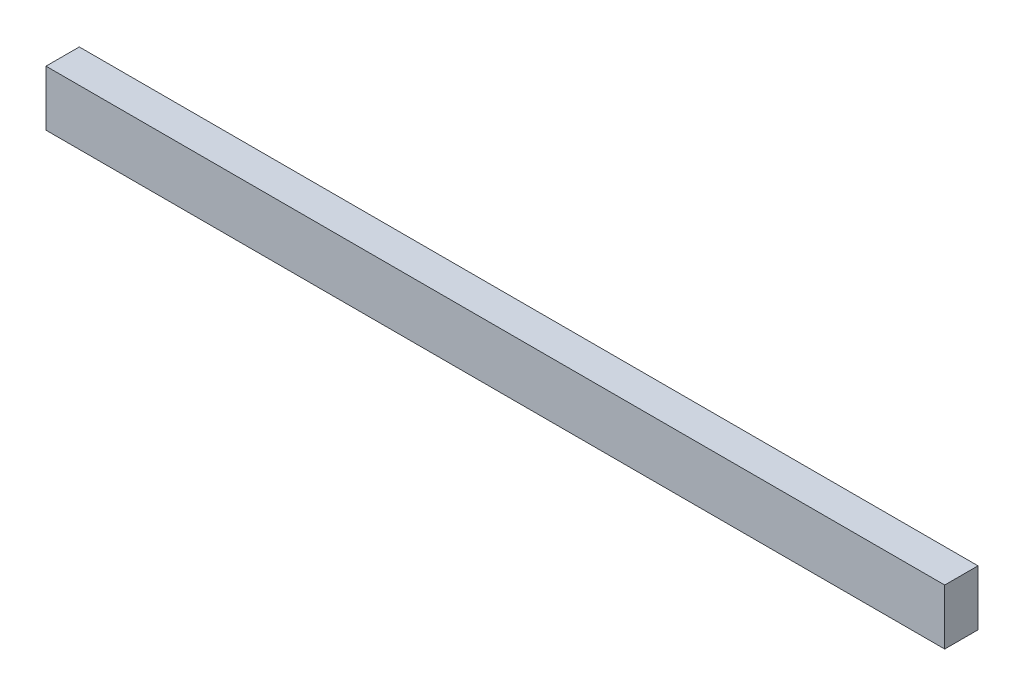
ISO-10303-21;
HEADER;
FILE_DESCRIPTION(('STEP AP214'),'2;1');
FILE_NAME('part.step','',(''),(''),'','','');
FILE_SCHEMA(('AUTOMOTIVE_DESIGN { 1 0 10303 214 1 1 1 1 }'));
ENDSEC;
DATA;
#1=APPLICATION_CONTEXT('core data for automotive mechanical design processes');
#2=APPLICATION_PROTOCOL_DEFINITION('international standard','automotive_design',2000,#1);
#3=PRODUCT_CONTEXT('',#1,'mechanical');
#4=PRODUCT('Part','Part','',(#3));
#5=PRODUCT_RELATED_PRODUCT_CATEGORY('part','',(#4));
#6=PRODUCT_DEFINITION_FORMATION('','',#4);
#7=PRODUCT_DEFINITION_CONTEXT('part definition',#1,'design');
#8=PRODUCT_DEFINITION('design','',#6,#7);
#9=PRODUCT_DEFINITION_SHAPE('','',#8);
#10=(LENGTH_UNIT() NAMED_UNIT(*) SI_UNIT(.MILLI.,.METRE.));
#11=(NAMED_UNIT(*) PLANE_ANGLE_UNIT() SI_UNIT($,.RADIAN.));
#12=(NAMED_UNIT(*) SI_UNIT($,.STERADIAN.) SOLID_ANGLE_UNIT());
#13=UNCERTAINTY_MEASURE_WITH_UNIT(LENGTH_MEASURE(1.E-05),#10,'distance_accuracy_value','');
#14=(GEOMETRIC_REPRESENTATION_CONTEXT(3) GLOBAL_UNCERTAINTY_ASSIGNED_CONTEXT((#13)) GLOBAL_UNIT_ASSIGNED_CONTEXT((#10,
#11,#12)) REPRESENTATION_CONTEXT('',''));
#15=CARTESIAN_POINT('',(0.,0.,0.));
#16=DIRECTION('',(0.,0.,1.));
#17=DIRECTION('',(1.,0.,0.));
#18=AXIS2_PLACEMENT_3D('',#15,#16,#17);
#19=CARTESIAN_POINT('',(257.175,31.75,9.525));
#20=DIRECTION('',(-1.,0.,0.));
#21=DIRECTION('',(0.,0.,1.));
#22=AXIS2_PLACEMENT_3D('',#19,#20,#21);
#23=PLANE('',#22);
#24=DIRECTION('',(0.,0.,-1.));
#25=VECTOR('',#24,1.);
#26=CARTESIAN_POINT('',(257.175,0.,9.525));
#27=LINE('',#26,#25);
#28=CARTESIAN_POINT('',(257.175,0.,9.525));
#29=VERTEX_POINT('',#28);
#30=CARTESIAN_POINT('',(257.175,0.,-9.525));
#31=VERTEX_POINT('',#30);
#32=EDGE_CURVE('E141',#29,#31,#27,.T.);
#33=ORIENTED_EDGE('',*,*,#32,.T.);
#34=DIRECTION('',(0.,-1.,0.));
#35=VECTOR('',#34,1.);
#36=CARTESIAN_POINT('',(257.175,31.75,-9.525));
#37=LINE('',#36,#35);
#38=CARTESIAN_POINT('',(257.175,31.75,-9.525));
#39=VERTEX_POINT('',#38);
#40=EDGE_CURVE('E11',#39,#31,#37,.T.);
#41=ORIENTED_EDGE('',*,*,#40,.F.);
#42=DIRECTION('',(0.,0.,-1.));
#43=VECTOR('',#42,1.);
#44=CARTESIAN_POINT('',(257.175,31.75,9.525));
#45=LINE('',#44,#43);
#46=CARTESIAN_POINT('',(257.175,31.75,9.525));
#47=VERTEX_POINT('',#46);
#48=EDGE_CURVE('E142',#47,#39,#45,.T.);
#49=ORIENTED_EDGE('',*,*,#48,.F.);
#50=DIRECTION('',(0.,-1.,0.));
#51=VECTOR('',#50,1.);
#52=CARTESIAN_POINT('',(257.175,31.75,9.525));
#53=LINE('',#52,#51);
#54=EDGE_CURVE('E148',#47,#29,#53,.T.);
#55=ORIENTED_EDGE('',*,*,#54,.T.);
#56=EDGE_LOOP('',(#33,#41,#49,#55));
#57=FACE_BOUND('',#56,.T.);
#58=ADVANCED_FACE('F39',(#57),#23,.F.);
#59=CARTESIAN_POINT('',(-257.175,31.75,-9.525));
#60=DIRECTION('',(0.,0.,1.));
#61=DIRECTION('',(1.,0.,0.));
#62=AXIS2_PLACEMENT_3D('',#59,#60,#61);
#63=PLANE('',#62);
#64=CARTESIAN_POINT('',(171.45,15.875,-9.525));
#65=DIRECTION('',(0.,0.,-1.));
#66=DIRECTION('',(-1.,0.,0.));
#67=AXIS2_PLACEMENT_3D('',#64,#65,#66);
#68=CIRCLE('',#67,1.58749999999999);
#69=CARTESIAN_POINT('',(169.8625,15.875,-9.525));
#70=VERTEX_POINT('',#69);
#71=EDGE_CURVE('E113',#70,#70,#68,.T.);
#72=ORIENTED_EDGE('',*,*,#71,.F.);
#73=EDGE_LOOP('',(#72));
#74=FACE_BOUND('',#73,.T.);
#75=CARTESIAN_POINT('',(85.7250000000001,15.875,-9.525));
#76=DIRECTION('',(0.,0.,-1.));
#77=DIRECTION('',(-1.,0.,0.));
#78=AXIS2_PLACEMENT_3D('',#75,#76,#77);
#79=CIRCLE('',#78,1.58749999999999);
#80=CARTESIAN_POINT('',(84.1375000000001,15.875,-9.525));
#81=VERTEX_POINT('',#80);
#82=EDGE_CURVE('E112',#81,#81,#79,.T.);
#83=ORIENTED_EDGE('',*,*,#82,.F.);
#84=EDGE_LOOP('',(#83));
#85=FACE_BOUND('',#84,.T.);
#86=CARTESIAN_POINT('',(0.,15.875,-9.525));
#87=DIRECTION('',(0.,0.,-1.));
#88=DIRECTION('',(-1.,0.,0.));
#89=AXIS2_PLACEMENT_3D('',#86,#87,#88);
#90=CIRCLE('',#89,1.58749999999999);
#91=CARTESIAN_POINT('',(-1.58749999999993,15.875,-9.525));
#92=VERTEX_POINT('',#91);
#93=EDGE_CURVE('E123',#92,#92,#90,.T.);
#94=ORIENTED_EDGE('',*,*,#93,.F.);
#95=EDGE_LOOP('',(#94));
#96=FACE_BOUND('',#95,.T.);
#97=CARTESIAN_POINT('',(-85.7249999999999,15.875,-9.525));
#98=DIRECTION('',(0.,0.,-1.));
#99=DIRECTION('',(-1.,0.,0.));
#100=AXIS2_PLACEMENT_3D('',#97,#98,#99);
#101=CIRCLE('',#100,1.58749999999999);
#102=CARTESIAN_POINT('',(-87.3124999999999,15.875,-9.525));
#103=VERTEX_POINT('',#102);
#104=EDGE_CURVE('E129',#103,#103,#101,.T.);
#105=ORIENTED_EDGE('',*,*,#104,.F.);
#106=EDGE_LOOP('',(#105));
#107=FACE_BOUND('',#106,.T.);
#108=CARTESIAN_POINT('',(-171.45,15.875,-9.525));
#109=DIRECTION('',(0.,0.,-1.));
#110=DIRECTION('',(-1.,0.,0.));
#111=AXIS2_PLACEMENT_3D('',#108,#109,#110);
#112=CIRCLE('',#111,1.58749999999999);
#113=CARTESIAN_POINT('',(-173.0375,15.875,-9.525));
#114=VERTEX_POINT('',#113);
#115=EDGE_CURVE('E135',#114,#114,#112,.T.);
#116=ORIENTED_EDGE('',*,*,#115,.F.);
#117=EDGE_LOOP('',(#116));
#118=FACE_BOUND('',#117,.T.);
#119=DIRECTION('',(-1.,0.,0.));
#120=VECTOR('',#119,1.);
#121=CARTESIAN_POINT('',(-257.175,0.,-9.525));
#122=LINE('',#121,#120);
#123=CARTESIAN_POINT('',(-257.175,0.,-9.525));
#124=VERTEX_POINT('',#123);
#125=EDGE_CURVE('E151',#31,#124,#122,.T.);
#126=ORIENTED_EDGE('',*,*,#125,.T.);
#127=DIRECTION('',(0.,-1.,0.));
#128=VECTOR('',#127,1.);
#129=CARTESIAN_POINT('',(-257.175,31.75,-9.525));
#130=LINE('',#129,#128);
#131=CARTESIAN_POINT('',(-257.175,31.75,-9.525));
#132=VERTEX_POINT('',#131);
#133=EDGE_CURVE('E47',#132,#124,#130,.T.);
#134=ORIENTED_EDGE('',*,*,#133,.F.);
#135=DIRECTION('',(-1.,0.,0.));
#136=VECTOR('',#135,1.);
#137=CARTESIAN_POINT('',(-257.175,31.75,-9.525));
#138=LINE('',#137,#136);
#139=EDGE_CURVE('E86',#39,#132,#138,.T.);
#140=ORIENTED_EDGE('',*,*,#139,.F.);
#141=ORIENTED_EDGE('',*,*,#40,.T.);
#142=EDGE_LOOP('',(#126,#134,#140,#141));
#143=FACE_BOUND('',#142,.T.);
#144=ADVANCED_FACE('F174',(#74,#85,#96,#107,#118,#143),#63,.F.);
#145=CARTESIAN_POINT('',(-257.175,31.75,9.525));
#146=DIRECTION('',(1.,0.,0.));
#147=DIRECTION('',(0.,0.,-1.));
#148=AXIS2_PLACEMENT_3D('',#145,#146,#147);
#149=PLANE('',#148);
#150=DIRECTION('',(0.,0.,1.));
#151=VECTOR('',#150,1.);
#152=CARTESIAN_POINT('',(-257.175,0.,9.525));
#153=LINE('',#152,#151);
#154=CARTESIAN_POINT('',(-257.175,0.,9.525));
#155=VERTEX_POINT('',#154);
#156=EDGE_CURVE('E73',#124,#155,#153,.T.);
#157=ORIENTED_EDGE('',*,*,#156,.T.);
#158=DIRECTION('',(0.,-1.,0.));
#159=VECTOR('',#158,1.);
#160=CARTESIAN_POINT('',(-257.175,31.75,9.525));
#161=LINE('',#160,#159);
#162=CARTESIAN_POINT('',(-257.175,31.75,9.525));
#163=VERTEX_POINT('',#162);
#164=EDGE_CURVE('E156',#163,#155,#161,.T.);
#165=ORIENTED_EDGE('',*,*,#164,.F.);
#166=DIRECTION('',(0.,0.,1.));
#167=VECTOR('',#166,1.);
#168=CARTESIAN_POINT('',(-257.175,31.75,9.525));
#169=LINE('',#168,#167);
#170=EDGE_CURVE('E145',#132,#163,#169,.T.);
#171=ORIENTED_EDGE('',*,*,#170,.F.);
#172=ORIENTED_EDGE('',*,*,#133,.T.);
#173=EDGE_LOOP('',(#157,#165,#171,#172));
#174=FACE_BOUND('',#173,.T.);
#175=ADVANCED_FACE('F158',(#174),#149,.F.);
#176=CARTESIAN_POINT('',(-257.175,31.75,9.525));
#177=DIRECTION('',(0.,0.,-1.));
#178=DIRECTION('',(-1.,0.,0.));
#179=AXIS2_PLACEMENT_3D('',#176,#177,#178);
#180=PLANE('',#179);
#181=DIRECTION('',(1.,0.,0.));
#182=VECTOR('',#181,1.);
#183=CARTESIAN_POINT('',(-257.175,0.,9.525));
#184=LINE('',#183,#182);
#185=EDGE_CURVE('E79',#155,#29,#184,.T.);
#186=ORIENTED_EDGE('',*,*,#185,.T.);
#187=ORIENTED_EDGE('',*,*,#54,.F.);
#188=DIRECTION('',(1.,0.,0.));
#189=VECTOR('',#188,1.);
#190=CARTESIAN_POINT('',(-257.175,31.75,9.525));
#191=LINE('',#190,#189);
#192=EDGE_CURVE('E55',#163,#47,#191,.T.);
#193=ORIENTED_EDGE('',*,*,#192,.F.);
#194=ORIENTED_EDGE('',*,*,#164,.T.);
#195=EDGE_LOOP('',(#186,#187,#193,#194));
#196=FACE_BOUND('',#195,.T.);
#197=ADVANCED_FACE('F165',(#196),#180,.F.);
#198=CARTESIAN_POINT('',(0.,31.75,0.));
#199=DIRECTION('',(0.,-1.,0.));
#200=DIRECTION('',(0.,0.,-1.));
#201=AXIS2_PLACEMENT_3D('',#198,#199,#200);
#202=PLANE('',#201);
#203=ORIENTED_EDGE('',*,*,#48,.T.);
#204=ORIENTED_EDGE('',*,*,#139,.T.);
#205=ORIENTED_EDGE('',*,*,#170,.T.);
#206=ORIENTED_EDGE('',*,*,#192,.T.);
#207=EDGE_LOOP('',(#203,#204,#205,#206));
#208=FACE_BOUND('',#207,.T.);
#209=ADVANCED_FACE('F167',(#208),#202,.F.);
#210=CARTESIAN_POINT('',(0.,0.,0.));
#211=DIRECTION('',(0.,-1.,0.));
#212=DIRECTION('',(0.,0.,-1.));
#213=AXIS2_PLACEMENT_3D('',#210,#211,#212);
#214=PLANE('',#213);
#215=ORIENTED_EDGE('',*,*,#32,.F.);
#216=ORIENTED_EDGE('',*,*,#185,.F.);
#217=ORIENTED_EDGE('',*,*,#156,.F.);
#218=ORIENTED_EDGE('',*,*,#125,.F.);
#219=EDGE_LOOP('',(#215,#216,#217,#218));
#220=FACE_BOUND('',#219,.T.);
#221=ADVANCED_FACE('F161',(#220),#214,.T.);
#222=CARTESIAN_POINT('',(-171.45,15.875,1.5875));
#223=DIRECTION('',(0.,0.,-1.));
#224=DIRECTION('',(-1.,0.,0.));
#225=AXIS2_PLACEMENT_3D('',#222,#223,#224);
#226=CONICAL_SURFACE('',#225,1.58749999999999,1.02974425867665);
#227=CARTESIAN_POINT('',(-171.45,15.875,2.54136623270625));
#228=VERTEX_POINT('',#227);
#229=VERTEX_LOOP('',#228);
#230=FACE_BOUND('',#229,.T.);
#231=CARTESIAN_POINT('',(-171.45,15.875,1.5875));
#232=DIRECTION('',(0.,0.,-1.));
#233=DIRECTION('',(-1.,0.,0.));
#234=AXIS2_PLACEMENT_3D('',#231,#232,#233);
#235=CIRCLE('',#234,1.58749999999999);
#236=CARTESIAN_POINT('',(-173.0375,15.875,1.5875));
#237=VERTEX_POINT('',#236);
#238=EDGE_CURVE('E138',#237,#237,#235,.T.);
#239=ORIENTED_EDGE('',*,*,#238,.T.);
#240=EDGE_LOOP('',(#239));
#241=FACE_BOUND('',#240,.T.);
#242=ADVANCED_FACE('F199',(#230,#241),#226,.F.);
#243=CARTESIAN_POINT('',(-171.45,15.875,-9.525));
#244=DIRECTION('',(0.,0.,-1.));
#245=DIRECTION('',(-1.,0.,0.));
#246=AXIS2_PLACEMENT_3D('',#243,#244,#245);
#247=CYLINDRICAL_SURFACE('',#246,1.58749999999999);
#248=ORIENTED_EDGE('',*,*,#238,.F.);
#249=EDGE_LOOP('',(#248));
#250=FACE_BOUND('',#249,.T.);
#251=ORIENTED_EDGE('',*,*,#115,.T.);
#252=EDGE_LOOP('',(#251));
#253=FACE_BOUND('',#252,.T.);
#254=ADVANCED_FACE('F196',(#250,#253),#247,.F.);
#255=CARTESIAN_POINT('',(-85.7249999999999,15.875,1.5875));
#256=DIRECTION('',(0.,0.,-1.));
#257=DIRECTION('',(-1.,0.,0.));
#258=AXIS2_PLACEMENT_3D('',#255,#256,#257);
#259=CONICAL_SURFACE('',#258,1.58749999999999,1.02974425867665);
#260=CARTESIAN_POINT('',(-85.7249999999999,15.875,2.54136623270625));
#261=VERTEX_POINT('',#260);
#262=VERTEX_LOOP('',#261);
#263=FACE_BOUND('',#262,.T.);
#264=CARTESIAN_POINT('',(-85.7249999999999,15.875,1.5875));
#265=DIRECTION('',(0.,0.,-1.));
#266=DIRECTION('',(-1.,0.,0.));
#267=AXIS2_PLACEMENT_3D('',#264,#265,#266);
#268=CIRCLE('',#267,1.58749999999999);
#269=CARTESIAN_POINT('',(-87.3124999999999,15.875,1.5875));
#270=VERTEX_POINT('',#269);
#271=EDGE_CURVE('E132',#270,#270,#268,.T.);
#272=ORIENTED_EDGE('',*,*,#271,.T.);
#273=EDGE_LOOP('',(#272));
#274=FACE_BOUND('',#273,.T.);
#275=ADVANCED_FACE('F198',(#263,#274),#259,.F.);
#276=CARTESIAN_POINT('',(-85.7249999999999,15.875,-9.525));
#277=DIRECTION('',(0.,0.,-1.));
#278=DIRECTION('',(-1.,0.,0.));
#279=AXIS2_PLACEMENT_3D('',#276,#277,#278);
#280=CYLINDRICAL_SURFACE('',#279,1.58749999999999);
#281=ORIENTED_EDGE('',*,*,#271,.F.);
#282=EDGE_LOOP('',(#281));
#283=FACE_BOUND('',#282,.T.);
#284=ORIENTED_EDGE('',*,*,#104,.T.);
#285=EDGE_LOOP('',(#284));
#286=FACE_BOUND('',#285,.T.);
#287=ADVANCED_FACE('F206',(#283,#286),#280,.F.);
#288=CARTESIAN_POINT('',(0.,15.875,1.5875));
#289=DIRECTION('',(0.,0.,-1.));
#290=DIRECTION('',(-1.,0.,0.));
#291=AXIS2_PLACEMENT_3D('',#288,#289,#290);
#292=CONICAL_SURFACE('',#291,1.5875,1.02974425867665);
#293=CARTESIAN_POINT('',(0.,15.875,2.54136623270625));
#294=VERTEX_POINT('',#293);
#295=VERTEX_LOOP('',#294);
#296=FACE_BOUND('',#295,.T.);
#297=CARTESIAN_POINT('',(0.,15.875,1.5875));
#298=DIRECTION('',(0.,0.,-1.));
#299=DIRECTION('',(-1.,0.,0.));
#300=AXIS2_PLACEMENT_3D('',#297,#298,#299);
#301=CIRCLE('',#300,1.5875);
#302=CARTESIAN_POINT('',(-1.58749999999994,15.875,1.5875));
#303=VERTEX_POINT('',#302);
#304=EDGE_CURVE('E126',#303,#303,#301,.T.);
#305=ORIENTED_EDGE('',*,*,#304,.T.);
#306=EDGE_LOOP('',(#305));
#307=FACE_BOUND('',#306,.T.);
#308=ADVANCED_FACE('F239',(#296,#307),#292,.F.);
#309=CARTESIAN_POINT('',(0.,15.875,-9.525));
#310=DIRECTION('',(0.,0.,-1.));
#311=DIRECTION('',(-1.,0.,0.));
#312=AXIS2_PLACEMENT_3D('',#309,#310,#311);
#313=CYLINDRICAL_SURFACE('',#312,1.58749999999999);
#314=ORIENTED_EDGE('',*,*,#304,.F.);
#315=EDGE_LOOP('',(#314));
#316=FACE_BOUND('',#315,.T.);
#317=ORIENTED_EDGE('',*,*,#93,.T.);
#318=EDGE_LOOP('',(#317));
#319=FACE_BOUND('',#318,.T.);
#320=ADVANCED_FACE('F248',(#316,#319),#313,.F.);
#321=CARTESIAN_POINT('',(85.7250000000001,15.875,1.5875));
#322=DIRECTION('',(0.,0.,-1.));
#323=DIRECTION('',(-1.,0.,0.));
#324=AXIS2_PLACEMENT_3D('',#321,#322,#323);
#325=CONICAL_SURFACE('',#324,1.58749999999999,1.02974425867665);
#326=CARTESIAN_POINT('',(85.7250000000001,15.875,2.54136623270625));
#327=VERTEX_POINT('',#326);
#328=VERTEX_LOOP('',#327);
#329=FACE_BOUND('',#328,.T.);
#330=CARTESIAN_POINT('',(85.7250000000001,15.875,1.5875));
#331=DIRECTION('',(0.,0.,-1.));
#332=DIRECTION('',(-1.,0.,0.));
#333=AXIS2_PLACEMENT_3D('',#330,#331,#332);
#334=CIRCLE('',#333,1.58749999999999);
#335=CARTESIAN_POINT('',(84.1375000000001,15.875,1.5875));
#336=VERTEX_POINT('',#335);
#337=EDGE_CURVE('E116',#336,#336,#334,.T.);
#338=ORIENTED_EDGE('',*,*,#337,.T.);
#339=EDGE_LOOP('',(#338));
#340=FACE_BOUND('',#339,.T.);
#341=ADVANCED_FACE('F258',(#329,#340),#325,.F.);
#342=CARTESIAN_POINT('',(85.7250000000001,15.875,-9.525));
#343=DIRECTION('',(0.,0.,-1.));
#344=DIRECTION('',(-1.,0.,0.));
#345=AXIS2_PLACEMENT_3D('',#342,#343,#344);
#346=CYLINDRICAL_SURFACE('',#345,1.58749999999999);
#347=ORIENTED_EDGE('',*,*,#337,.F.);
#348=EDGE_LOOP('',(#347));
#349=FACE_BOUND('',#348,.T.);
#350=ORIENTED_EDGE('',*,*,#82,.T.);
#351=EDGE_LOOP('',(#350));
#352=FACE_BOUND('',#351,.T.);
#353=ADVANCED_FACE('F106',(#349,#352),#346,.F.);
#354=CARTESIAN_POINT('',(171.45,15.875,1.5875));
#355=DIRECTION('',(0.,0.,-1.));
#356=DIRECTION('',(-1.,0.,0.));
#357=AXIS2_PLACEMENT_3D('',#354,#355,#356);
#358=CONICAL_SURFACE('',#357,1.58749999999999,1.02974425867665);
#359=CARTESIAN_POINT('',(171.45,15.875,2.54136623270625));
#360=VERTEX_POINT('',#359);
#361=VERTEX_LOOP('',#360);
#362=FACE_BOUND('',#361,.T.);
#363=CARTESIAN_POINT('',(171.45,15.875,1.5875));
#364=DIRECTION('',(0.,0.,-1.));
#365=DIRECTION('',(-1.,0.,0.));
#366=AXIS2_PLACEMENT_3D('',#363,#364,#365);
#367=CIRCLE('',#366,1.58749999999999);
#368=CARTESIAN_POINT('',(169.8625,15.875,1.5875));
#369=VERTEX_POINT('',#368);
#370=EDGE_CURVE('E110',#369,#369,#367,.T.);
#371=ORIENTED_EDGE('',*,*,#370,.T.);
#372=EDGE_LOOP('',(#371));
#373=FACE_BOUND('',#372,.T.);
#374=ADVANCED_FACE('F102',(#362,#373),#358,.F.);
#375=CARTESIAN_POINT('',(171.45,15.875,-9.525));
#376=DIRECTION('',(0.,0.,-1.));
#377=DIRECTION('',(-1.,0.,0.));
#378=AXIS2_PLACEMENT_3D('',#375,#376,#377);
#379=CYLINDRICAL_SURFACE('',#378,1.58749999999999);
#380=ORIENTED_EDGE('',*,*,#370,.F.);
#381=EDGE_LOOP('',(#380));
#382=FACE_BOUND('',#381,.T.);
#383=ORIENTED_EDGE('',*,*,#71,.T.);
#384=EDGE_LOOP('',(#383));
#385=FACE_BOUND('',#384,.T.);
#386=ADVANCED_FACE('F105',(#382,#385),#379,.F.);
#387=CLOSED_SHELL('',(#58,#144,#175,#197,#209,#221,#242,#254,#275,#287,#308,#320,#341,#353,#374,#386));
#388=MANIFOLD_SOLID_BREP('B2',#387);
#389=ADVANCED_BREP_SHAPE_REPRESENTATION('',(#18,#388),#14);
#390=SHAPE_DEFINITION_REPRESENTATION(#9,#389);
ENDSEC;
END-ISO-10303-21;
